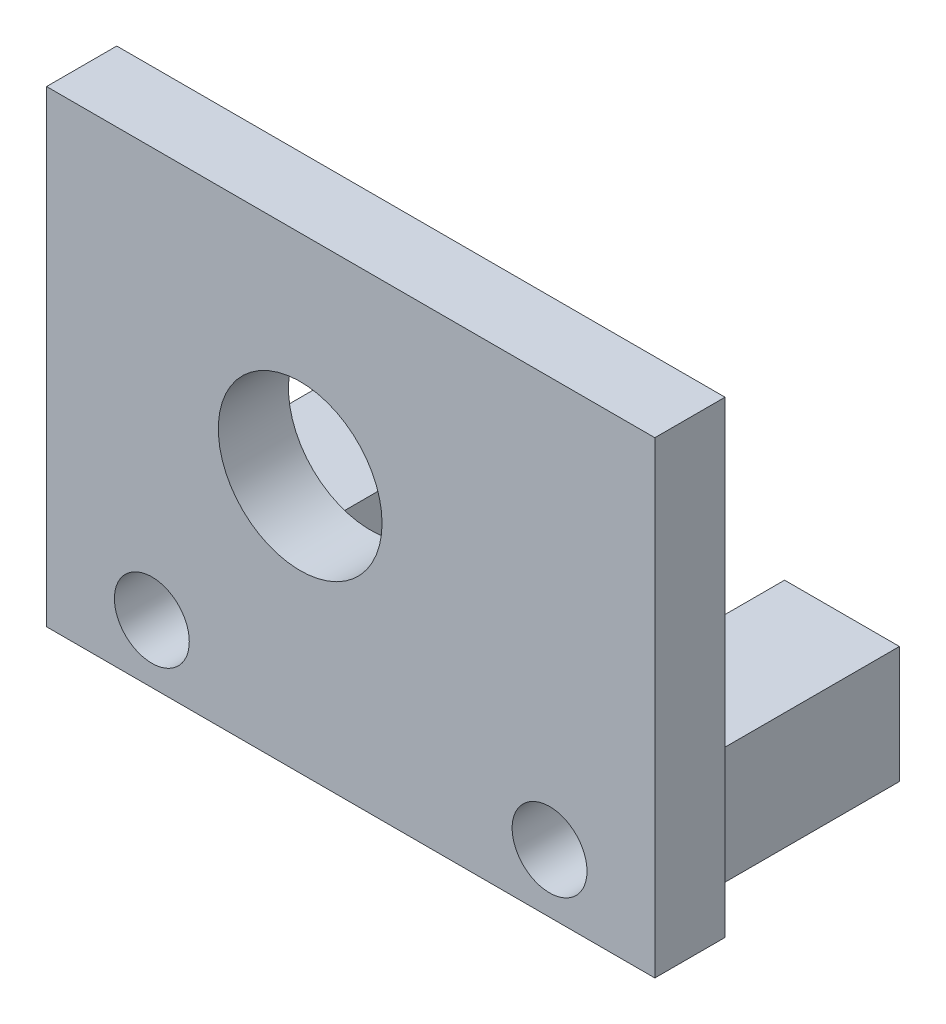
ISO-10303-21;
HEADER;
FILE_DESCRIPTION(('STEP AP214'),'2;1');
FILE_NAME('part.step','',(''),(''),'','','');
FILE_SCHEMA(('AUTOMOTIVE_DESIGN { 1 0 10303 214 1 1 1 1 }'));
ENDSEC;
DATA;
#1=APPLICATION_CONTEXT('core data for automotive mechanical design processes');
#2=APPLICATION_PROTOCOL_DEFINITION('international standard','automotive_design',2000,#1);
#3=PRODUCT_CONTEXT('',#1,'mechanical');
#4=PRODUCT('Part','Part','',(#3));
#5=PRODUCT_RELATED_PRODUCT_CATEGORY('part','',(#4));
#6=PRODUCT_DEFINITION_FORMATION('','',#4);
#7=PRODUCT_DEFINITION_CONTEXT('part definition',#1,'design');
#8=PRODUCT_DEFINITION('design','',#6,#7);
#9=PRODUCT_DEFINITION_SHAPE('','',#8);
#10=(LENGTH_UNIT() NAMED_UNIT(*) SI_UNIT(.MILLI.,.METRE.));
#11=(NAMED_UNIT(*) PLANE_ANGLE_UNIT() SI_UNIT($,.RADIAN.));
#12=(NAMED_UNIT(*) SI_UNIT($,.STERADIAN.) SOLID_ANGLE_UNIT());
#13=UNCERTAINTY_MEASURE_WITH_UNIT(LENGTH_MEASURE(1.E-05),#10,'distance_accuracy_value','');
#14=(GEOMETRIC_REPRESENTATION_CONTEXT(3) GLOBAL_UNCERTAINTY_ASSIGNED_CONTEXT((#13)) GLOBAL_UNIT_ASSIGNED_CONTEXT((#10,
#11,#12)) REPRESENTATION_CONTEXT('',''));
#15=CARTESIAN_POINT('',(0.,0.,0.));
#16=DIRECTION('',(0.,0.,1.));
#17=DIRECTION('',(1.,0.,0.));
#18=AXIS2_PLACEMENT_3D('',#15,#16,#17);
#19=CARTESIAN_POINT('',(0.,0.,3.));
#20=DIRECTION('',(0.,0.,1.));
#21=DIRECTION('',(1.,0.,0.));
#22=AXIS2_PLACEMENT_3D('',#19,#20,#21);
#23=PLANE('',#22);
#24=CARTESIAN_POINT('',(-6.34,-8.5,3.));
#25=DIRECTION('',(0.,0.,1.));
#26=DIRECTION('',(1.,0.,0.));
#27=AXIS2_PLACEMENT_3D('',#24,#25,#26);
#28=CIRCLE('',#27,1.6);
#29=CARTESIAN_POINT('',(-4.74,-8.5,3.));
#30=VERTEX_POINT('',#29);
#31=EDGE_CURVE('E223',#30,#30,#28,.T.);
#32=ORIENTED_EDGE('',*,*,#31,.F.);
#33=EDGE_LOOP('',(#32));
#34=FACE_BOUND('',#33,.T.);
#35=DIRECTION('',(0.,-1.,0.));
#36=VECTOR('',#35,1.);
#37=CARTESIAN_POINT('',(-10.84,9.,3.));
#38=LINE('',#37,#36);
#39=CARTESIAN_POINT('',(-10.84,9.,3.));
#40=VERTEX_POINT('',#39);
#41=CARTESIAN_POINT('',(-10.84,-11.,3.));
#42=VERTEX_POINT('',#41);
#43=EDGE_CURVE('E236',#40,#42,#38,.T.);
#44=ORIENTED_EDGE('',*,*,#43,.T.);
#45=DIRECTION('',(1.,0.,0.));
#46=VECTOR('',#45,1.);
#47=CARTESIAN_POINT('',(-10.84,-11.,3.));
#48=LINE('',#47,#46);
#49=CARTESIAN_POINT('',(15.16,-11.,3.));
#50=VERTEX_POINT('',#49);
#51=EDGE_CURVE('E240',#42,#50,#48,.T.);
#52=ORIENTED_EDGE('',*,*,#51,.T.);
#53=DIRECTION('',(0.,1.,0.));
#54=VECTOR('',#53,1.);
#55=CARTESIAN_POINT('',(15.16,9.,3.));
#56=LINE('',#55,#54);
#57=CARTESIAN_POINT('',(15.16,9.,3.));
#58=VERTEX_POINT('',#57);
#59=EDGE_CURVE('E244',#50,#58,#56,.T.);
#60=ORIENTED_EDGE('',*,*,#59,.T.);
#61=DIRECTION('',(-1.,0.,0.));
#62=VECTOR('',#61,1.);
#63=CARTESIAN_POINT('',(-10.84,9.,3.));
#64=LINE('',#63,#62);
#65=EDGE_CURVE('E247',#58,#40,#64,.T.);
#66=ORIENTED_EDGE('',*,*,#65,.T.);
#67=EDGE_LOOP('',(#44,#52,#60,#66));
#68=FACE_BOUND('',#67,.T.);
#69=CARTESIAN_POINT('',(0.,0.,3.));
#70=DIRECTION('',(0.,0.,1.));
#71=DIRECTION('',(1.,0.,0.));
#72=AXIS2_PLACEMENT_3D('',#69,#70,#71);
#73=CIRCLE('',#72,3.5);
#74=CARTESIAN_POINT('',(3.5,0.,3.));
#75=VERTEX_POINT('',#74);
#76=EDGE_CURVE('E228',#75,#75,#73,.T.);
#77=ORIENTED_EDGE('',*,*,#76,.F.);
#78=EDGE_LOOP('',(#77));
#79=FACE_BOUND('',#78,.T.);
#80=CARTESIAN_POINT('',(10.66,-8.5,3.));
#81=DIRECTION('',(0.,0.,1.));
#82=DIRECTION('',(1.,0.,0.));
#83=AXIS2_PLACEMENT_3D('',#80,#81,#82);
#84=CIRCLE('',#83,1.6);
#85=CARTESIAN_POINT('',(12.26,-8.5,3.));
#86=VERTEX_POINT('',#85);
#87=EDGE_CURVE('E212',#86,#86,#84,.T.);
#88=ORIENTED_EDGE('',*,*,#87,.F.);
#89=EDGE_LOOP('',(#88));
#90=FACE_BOUND('',#89,.T.);
#91=ADVANCED_FACE('F39',(#34,#68,#79,#90),#23,.T.);
#92=CARTESIAN_POINT('',(0.,0.,0.));
#93=DIRECTION('',(0.,0.,1.));
#94=DIRECTION('',(1.,0.,0.));
#95=AXIS2_PLACEMENT_3D('',#92,#93,#94);
#96=PLANE('',#95);
#97=DIRECTION('',(1.,0.,0.));
#98=VECTOR('',#97,1.);
#99=CARTESIAN_POINT('',(-10.84,-11.,0.));
#100=LINE('',#99,#98);
#101=CARTESIAN_POINT('',(13.1145705546597,-11.,0.));
#102=VERTEX_POINT('',#101);
#103=CARTESIAN_POINT('',(15.16,-11.,0.));
#104=VERTEX_POINT('',#103);
#105=EDGE_CURVE('E254',#102,#104,#100,.T.);
#106=ORIENTED_EDGE('',*,*,#105,.F.);
#107=DIRECTION('',(0.,1.,0.));
#108=VECTOR('',#107,1.);
#109=CARTESIAN_POINT('',(13.1145705546597,-6.,0.));
#110=LINE('',#109,#108);
#111=CARTESIAN_POINT('',(13.1145705546597,-6.,0.));
#112=VERTEX_POINT('',#111);
#113=EDGE_CURVE('E55',#102,#112,#110,.T.);
#114=ORIENTED_EDGE('',*,*,#113,.T.);
#115=DIRECTION('',(-1.,0.,0.));
#116=VECTOR('',#115,1.);
#117=CARTESIAN_POINT('',(8.20542944534033,-6.,0.));
#118=LINE('',#117,#116);
#119=CARTESIAN_POINT('',(8.20542944534033,-6.,0.));
#120=VERTEX_POINT('',#119);
#121=EDGE_CURVE('E135',#112,#120,#118,.T.);
#122=ORIENTED_EDGE('',*,*,#121,.T.);
#123=DIRECTION('',(0.,-1.,0.));
#124=VECTOR('',#123,1.);
#125=CARTESIAN_POINT('',(8.20542944534033,-6.,0.));
#126=LINE('',#125,#124);
#127=CARTESIAN_POINT('',(8.20542944534033,-11.,0.));
#128=VERTEX_POINT('',#127);
#129=EDGE_CURVE('E155',#120,#128,#126,.T.);
#130=ORIENTED_EDGE('',*,*,#129,.T.);
#131=CARTESIAN_POINT('',(-3.7752522737621,-11.,0.));
#132=VERTEX_POINT('',#131);
#133=EDGE_CURVE('E260',#132,#128,#100,.T.);
#134=ORIENTED_EDGE('',*,*,#133,.F.);
#135=DIRECTION('',(0.,1.,0.));
#136=VECTOR('',#135,1.);
#137=CARTESIAN_POINT('',(-3.7752522737621,-6.,0.));
#138=LINE('',#137,#136);
#139=CARTESIAN_POINT('',(-3.7752522737621,-6.,0.));
#140=VERTEX_POINT('',#139);
#141=EDGE_CURVE('E182',#132,#140,#138,.T.);
#142=ORIENTED_EDGE('',*,*,#141,.T.);
#143=DIRECTION('',(-1.,0.,0.));
#144=VECTOR('',#143,1.);
#145=CARTESIAN_POINT('',(-8.90474772623789,-6.,0.));
#146=LINE('',#145,#144);
#147=CARTESIAN_POINT('',(-8.90474772623789,-6.,0.));
#148=VERTEX_POINT('',#147);
#149=EDGE_CURVE('E203',#140,#148,#146,.T.);
#150=ORIENTED_EDGE('',*,*,#149,.T.);
#151=DIRECTION('',(0.,-1.,0.));
#152=VECTOR('',#151,1.);
#153=CARTESIAN_POINT('',(-8.90474772623789,-6.,0.));
#154=LINE('',#153,#152);
#155=CARTESIAN_POINT('',(-8.90474772623789,-11.,0.));
#156=VERTEX_POINT('',#155);
#157=EDGE_CURVE('E188',#148,#156,#154,.T.);
#158=ORIENTED_EDGE('',*,*,#157,.T.);
#159=CARTESIAN_POINT('',(-10.84,-11.,0.));
#160=VERTEX_POINT('',#159);
#161=EDGE_CURVE('E255',#160,#156,#100,.T.);
#162=ORIENTED_EDGE('',*,*,#161,.F.);
#163=DIRECTION('',(0.,-1.,0.));
#164=VECTOR('',#163,1.);
#165=CARTESIAN_POINT('',(-10.84,9.,0.));
#166=LINE('',#165,#164);
#167=CARTESIAN_POINT('',(-10.84,9.,0.));
#168=VERTEX_POINT('',#167);
#169=EDGE_CURVE('E232',#168,#160,#166,.T.);
#170=ORIENTED_EDGE('',*,*,#169,.F.);
#171=DIRECTION('',(-1.,0.,0.));
#172=VECTOR('',#171,1.);
#173=CARTESIAN_POINT('',(-10.84,9.,0.));
#174=LINE('',#173,#172);
#175=CARTESIAN_POINT('',(15.16,9.,0.));
#176=VERTEX_POINT('',#175);
#177=EDGE_CURVE('E241',#176,#168,#174,.T.);
#178=ORIENTED_EDGE('',*,*,#177,.F.);
#179=DIRECTION('',(0.,1.,0.));
#180=VECTOR('',#179,1.);
#181=CARTESIAN_POINT('',(15.16,9.,0.));
#182=LINE('',#181,#180);
#183=EDGE_CURVE('E259',#104,#176,#182,.T.);
#184=ORIENTED_EDGE('',*,*,#183,.F.);
#185=EDGE_LOOP('',(#106,#114,#122,#130,#134,#142,#150,#158,#162,#170,#178,#184));
#186=FACE_BOUND('',#185,.T.);
#187=CARTESIAN_POINT('',(0.,0.,0.));
#188=DIRECTION('',(0.,0.,1.));
#189=DIRECTION('',(1.,0.,0.));
#190=AXIS2_PLACEMENT_3D('',#187,#188,#189);
#191=CIRCLE('',#190,3.5);
#192=CARTESIAN_POINT('',(3.5,0.,0.));
#193=VERTEX_POINT('',#192);
#194=EDGE_CURVE('E227',#193,#193,#191,.T.);
#195=ORIENTED_EDGE('',*,*,#194,.T.);
#196=EDGE_LOOP('',(#195));
#197=FACE_BOUND('',#196,.T.);
#198=ADVANCED_FACE('F283',(#186,#197),#96,.F.);
#199=CARTESIAN_POINT('',(-10.84,9.,3.));
#200=DIRECTION('',(1.,0.,0.));
#201=DIRECTION('',(0.,0.,-1.));
#202=AXIS2_PLACEMENT_3D('',#199,#200,#201);
#203=PLANE('',#202);
#204=ORIENTED_EDGE('',*,*,#169,.T.);
#205=DIRECTION('',(0.,0.,-1.));
#206=VECTOR('',#205,1.);
#207=CARTESIAN_POINT('',(-10.84,-11.,3.));
#208=LINE('',#207,#206);
#209=EDGE_CURVE('E11',#42,#160,#208,.T.);
#210=ORIENTED_EDGE('',*,*,#209,.F.);
#211=ORIENTED_EDGE('',*,*,#43,.F.);
#212=DIRECTION('',(0.,0.,-1.));
#213=VECTOR('',#212,1.);
#214=CARTESIAN_POINT('',(-10.84,9.,3.));
#215=LINE('',#214,#213);
#216=EDGE_CURVE('E250',#40,#168,#215,.T.);
#217=ORIENTED_EDGE('',*,*,#216,.T.);
#218=EDGE_LOOP('',(#204,#210,#211,#217));
#219=FACE_BOUND('',#218,.T.);
#220=ADVANCED_FACE('F41',(#219),#203,.F.);
#221=CARTESIAN_POINT('',(-10.84,-11.,3.));
#222=DIRECTION('',(0.,1.,0.));
#223=DIRECTION('',(0.,0.,1.));
#224=AXIS2_PLACEMENT_3D('',#221,#222,#223);
#225=PLANE('',#224);
#226=ORIENTED_EDGE('',*,*,#161,.T.);
#227=DIRECTION('',(0.,0.,1.));
#228=VECTOR('',#227,1.);
#229=CARTESIAN_POINT('',(-8.90474772623789,-11.,-9.5));
#230=LINE('',#229,#228);
#231=CARTESIAN_POINT('',(-8.90474772623789,-11.,-9.5));
#232=VERTEX_POINT('',#231);
#233=EDGE_CURVE('E63',#232,#156,#230,.T.);
#234=ORIENTED_EDGE('',*,*,#233,.F.);
#235=DIRECTION('',(1.,0.,0.));
#236=VECTOR('',#235,1.);
#237=CARTESIAN_POINT('',(-8.90474772623789,-11.,-9.5));
#238=LINE('',#237,#236);
#239=CARTESIAN_POINT('',(-3.7752522737621,-11.,-9.5));
#240=VERTEX_POINT('',#239);
#241=EDGE_CURVE('E195',#232,#240,#238,.T.);
#242=ORIENTED_EDGE('',*,*,#241,.T.);
#243=DIRECTION('',(0.,0.,1.));
#244=VECTOR('',#243,1.);
#245=CARTESIAN_POINT('',(-3.7752522737621,-11.,-9.5));
#246=LINE('',#245,#244);
#247=EDGE_CURVE('E209',#240,#132,#246,.T.);
#248=ORIENTED_EDGE('',*,*,#247,.T.);
#249=ORIENTED_EDGE('',*,*,#133,.T.);
#250=DIRECTION('',(0.,0.,1.));
#251=VECTOR('',#250,1.);
#252=CARTESIAN_POINT('',(8.20542944534033,-11.,-9.5));
#253=LINE('',#252,#251);
#254=CARTESIAN_POINT('',(8.20542944534033,-11.,-9.5));
#255=VERTEX_POINT('',#254);
#256=EDGE_CURVE('E174',#255,#128,#253,.T.);
#257=ORIENTED_EDGE('',*,*,#256,.F.);
#258=DIRECTION('',(1.,0.,0.));
#259=VECTOR('',#258,1.);
#260=CARTESIAN_POINT('',(8.20542944534033,-11.,-9.5));
#261=LINE('',#260,#259);
#262=CARTESIAN_POINT('',(13.1145705546597,-11.,-9.5));
#263=VERTEX_POINT('',#262);
#264=EDGE_CURVE('E139',#255,#263,#261,.T.);
#265=ORIENTED_EDGE('',*,*,#264,.T.);
#266=DIRECTION('',(0.,0.,1.));
#267=VECTOR('',#266,1.);
#268=CARTESIAN_POINT('',(13.1145705546597,-11.,-9.5));
#269=LINE('',#268,#267);
#270=EDGE_CURVE('E153',#263,#102,#269,.T.);
#271=ORIENTED_EDGE('',*,*,#270,.T.);
#272=ORIENTED_EDGE('',*,*,#105,.T.);
#273=DIRECTION('',(0.,0.,-1.));
#274=VECTOR('',#273,1.);
#275=CARTESIAN_POINT('',(15.16,-11.,3.));
#276=LINE('',#275,#274);
#277=EDGE_CURVE('E48',#50,#104,#276,.T.);
#278=ORIENTED_EDGE('',*,*,#277,.F.);
#279=ORIENTED_EDGE('',*,*,#51,.F.);
#280=ORIENTED_EDGE('',*,*,#209,.T.);
#281=EDGE_LOOP('',(#226,#234,#242,#248,#249,#257,#265,#271,#272,#278,#279,#280));
#282=FACE_BOUND('',#281,.T.);
#283=ADVANCED_FACE('F295',(#282),#225,.F.);
#284=CARTESIAN_POINT('',(15.16,9.,3.));
#285=DIRECTION('',(-1.,0.,0.));
#286=DIRECTION('',(0.,0.,1.));
#287=AXIS2_PLACEMENT_3D('',#284,#285,#286);
#288=PLANE('',#287);
#289=ORIENTED_EDGE('',*,*,#183,.T.);
#290=DIRECTION('',(0.,0.,-1.));
#291=VECTOR('',#290,1.);
#292=CARTESIAN_POINT('',(15.16,9.,3.));
#293=LINE('',#292,#291);
#294=EDGE_CURVE('E268',#58,#176,#293,.T.);
#295=ORIENTED_EDGE('',*,*,#294,.F.);
#296=ORIENTED_EDGE('',*,*,#59,.F.);
#297=ORIENTED_EDGE('',*,*,#277,.T.);
#298=EDGE_LOOP('',(#289,#295,#296,#297));
#299=FACE_BOUND('',#298,.T.);
#300=ADVANCED_FACE('F277',(#299),#288,.F.);
#301=CARTESIAN_POINT('',(-10.84,9.,3.));
#302=DIRECTION('',(0.,-1.,0.));
#303=DIRECTION('',(0.,0.,-1.));
#304=AXIS2_PLACEMENT_3D('',#301,#302,#303);
#305=PLANE('',#304);
#306=ORIENTED_EDGE('',*,*,#177,.T.);
#307=ORIENTED_EDGE('',*,*,#216,.F.);
#308=ORIENTED_EDGE('',*,*,#65,.F.);
#309=ORIENTED_EDGE('',*,*,#294,.T.);
#310=EDGE_LOOP('',(#306,#307,#308,#309));
#311=FACE_BOUND('',#310,.T.);
#312=ADVANCED_FACE('F288',(#311),#305,.F.);
#313=CARTESIAN_POINT('',(0.,0.,3.));
#314=DIRECTION('',(0.,0.,-1.));
#315=DIRECTION('',(-1.,0.,0.));
#316=AXIS2_PLACEMENT_3D('',#313,#314,#315);
#317=CYLINDRICAL_SURFACE('',#316,3.5);
#318=ORIENTED_EDGE('',*,*,#76,.T.);
#319=EDGE_LOOP('',(#318));
#320=FACE_BOUND('',#319,.T.);
#321=ORIENTED_EDGE('',*,*,#194,.F.);
#322=EDGE_LOOP('',(#321));
#323=FACE_BOUND('',#322,.T.);
#324=ADVANCED_FACE('F334',(#320,#323),#317,.F.);
#325=CARTESIAN_POINT('',(-6.34,-8.5,3.));
#326=DIRECTION('',(0.,0.,-1.));
#327=DIRECTION('',(-1.,0.,0.));
#328=AXIS2_PLACEMENT_3D('',#325,#326,#327);
#329=CYLINDRICAL_SURFACE('',#328,1.6);
#330=ORIENTED_EDGE('',*,*,#31,.T.);
#331=EDGE_LOOP('',(#330));
#332=FACE_BOUND('',#331,.T.);
#333=CARTESIAN_POINT('',(-6.34,-8.5,-9.5));
#334=DIRECTION('',(0.,0.,1.));
#335=DIRECTION('',(1.,0.,0.));
#336=AXIS2_PLACEMENT_3D('',#333,#334,#335);
#337=CIRCLE('',#336,1.6);
#338=CARTESIAN_POINT('',(-4.74,-8.5,-9.5));
#339=VERTEX_POINT('',#338);
#340=EDGE_CURVE('E173',#339,#339,#337,.T.);
#341=ORIENTED_EDGE('',*,*,#340,.F.);
#342=EDGE_LOOP('',(#341));
#343=FACE_BOUND('',#342,.T.);
#344=ADVANCED_FACE('F368',(#332,#343),#329,.F.);
#345=CARTESIAN_POINT('',(10.66,-8.5,3.));
#346=DIRECTION('',(0.,0.,-1.));
#347=DIRECTION('',(-1.,0.,0.));
#348=AXIS2_PLACEMENT_3D('',#345,#346,#347);
#349=CYLINDRICAL_SURFACE('',#348,1.6);
#350=ORIENTED_EDGE('',*,*,#87,.T.);
#351=EDGE_LOOP('',(#350));
#352=FACE_BOUND('',#351,.T.);
#353=CARTESIAN_POINT('',(10.66,-8.5,-9.5));
#354=DIRECTION('',(0.,0.,1.));
#355=DIRECTION('',(1.,0.,0.));
#356=AXIS2_PLACEMENT_3D('',#353,#354,#355);
#357=CIRCLE('',#356,1.6);
#358=CARTESIAN_POINT('',(12.26,-8.5,-9.5));
#359=VERTEX_POINT('',#358);
#360=EDGE_CURVE('E161',#359,#359,#357,.T.);
#361=ORIENTED_EDGE('',*,*,#360,.F.);
#362=EDGE_LOOP('',(#361));
#363=FACE_BOUND('',#362,.T.);
#364=ADVANCED_FACE('F372',(#352,#363),#349,.F.);
#365=CARTESIAN_POINT('',(-3.7752522737621,-6.,-9.5));
#366=DIRECTION('',(1.,0.,0.));
#367=DIRECTION('',(0.,0.,-1.));
#368=AXIS2_PLACEMENT_3D('',#365,#366,#367);
#369=PLANE('',#368);
#370=ORIENTED_EDGE('',*,*,#141,.F.);
#371=ORIENTED_EDGE('',*,*,#247,.F.);
#372=DIRECTION('',(0.,1.,0.));
#373=VECTOR('',#372,1.);
#374=CARTESIAN_POINT('',(-3.7752522737621,-6.,-9.5));
#375=LINE('',#374,#373);
#376=CARTESIAN_POINT('',(-3.7752522737621,-6.,-9.5));
#377=VERTEX_POINT('',#376);
#378=EDGE_CURVE('E183',#240,#377,#375,.T.);
#379=ORIENTED_EDGE('',*,*,#378,.T.);
#380=DIRECTION('',(0.,0.,1.));
#381=VECTOR('',#380,1.);
#382=CARTESIAN_POINT('',(-3.7752522737621,-6.,-9.5));
#383=LINE('',#382,#381);
#384=EDGE_CURVE('E199',#377,#140,#383,.T.);
#385=ORIENTED_EDGE('',*,*,#384,.T.);
#386=EDGE_LOOP('',(#370,#371,#379,#385));
#387=FACE_BOUND('',#386,.T.);
#388=ADVANCED_FACE('F308',(#387),#369,.T.);
#389=CARTESIAN_POINT('',(-8.90474772623789,-6.,-9.5));
#390=DIRECTION('',(-1.,0.,0.));
#391=DIRECTION('',(0.,0.,1.));
#392=AXIS2_PLACEMENT_3D('',#389,#390,#391);
#393=PLANE('',#392);
#394=ORIENTED_EDGE('',*,*,#157,.F.);
#395=DIRECTION('',(0.,0.,1.));
#396=VECTOR('',#395,1.);
#397=CARTESIAN_POINT('',(-8.90474772623789,-6.,-9.5));
#398=LINE('',#397,#396);
#399=CARTESIAN_POINT('',(-8.90474772623789,-6.,-9.5));
#400=VERTEX_POINT('',#399);
#401=EDGE_CURVE('E215',#400,#148,#398,.T.);
#402=ORIENTED_EDGE('',*,*,#401,.F.);
#403=DIRECTION('',(0.,-1.,0.));
#404=VECTOR('',#403,1.);
#405=CARTESIAN_POINT('',(-8.90474772623789,-6.,-9.5));
#406=LINE('',#405,#404);
#407=EDGE_CURVE('E192',#400,#232,#406,.T.);
#408=ORIENTED_EDGE('',*,*,#407,.T.);
#409=ORIENTED_EDGE('',*,*,#233,.T.);
#410=EDGE_LOOP('',(#394,#402,#408,#409));
#411=FACE_BOUND('',#410,.T.);
#412=ADVANCED_FACE('F297',(#411),#393,.T.);
#413=CARTESIAN_POINT('',(-8.90474772623789,-6.,-9.5));
#414=DIRECTION('',(0.,1.,0.));
#415=DIRECTION('',(0.,0.,1.));
#416=AXIS2_PLACEMENT_3D('',#413,#414,#415);
#417=PLANE('',#416);
#418=ORIENTED_EDGE('',*,*,#149,.F.);
#419=ORIENTED_EDGE('',*,*,#384,.F.);
#420=DIRECTION('',(-1.,0.,0.));
#421=VECTOR('',#420,1.);
#422=CARTESIAN_POINT('',(-8.90474772623789,-6.,-9.5));
#423=LINE('',#422,#421);
#424=EDGE_CURVE('E187',#377,#400,#423,.T.);
#425=ORIENTED_EDGE('',*,*,#424,.T.);
#426=ORIENTED_EDGE('',*,*,#401,.T.);
#427=EDGE_LOOP('',(#418,#419,#425,#426));
#428=FACE_BOUND('',#427,.T.);
#429=ADVANCED_FACE('F305',(#428),#417,.T.);
#430=CARTESIAN_POINT('',(0.,0.,-9.5));
#431=DIRECTION('',(0.,0.,1.));
#432=DIRECTION('',(1.,0.,0.));
#433=AXIS2_PLACEMENT_3D('',#430,#431,#432);
#434=PLANE('',#433);
#435=ORIENTED_EDGE('',*,*,#340,.T.);
#436=EDGE_LOOP('',(#435));
#437=FACE_BOUND('',#436,.T.);
#438=ORIENTED_EDGE('',*,*,#378,.F.);
#439=ORIENTED_EDGE('',*,*,#241,.F.);
#440=ORIENTED_EDGE('',*,*,#407,.F.);
#441=ORIENTED_EDGE('',*,*,#424,.F.);
#442=EDGE_LOOP('',(#438,#439,#440,#441));
#443=FACE_BOUND('',#442,.T.);
#444=ADVANCED_FACE('F304',(#437,#443),#434,.F.);
#445=CARTESIAN_POINT('',(13.1145705546597,-6.,-9.5));
#446=DIRECTION('',(1.,0.,0.));
#447=DIRECTION('',(0.,0.,-1.));
#448=AXIS2_PLACEMENT_3D('',#445,#446,#447);
#449=PLANE('',#448);
#450=ORIENTED_EDGE('',*,*,#113,.F.);
#451=ORIENTED_EDGE('',*,*,#270,.F.);
#452=DIRECTION('',(0.,1.,0.));
#453=VECTOR('',#452,1.);
#454=CARTESIAN_POINT('',(13.1145705546597,-6.,-9.5));
#455=LINE('',#454,#453);
#456=CARTESIAN_POINT('',(13.1145705546597,-6.,-9.5));
#457=VERTEX_POINT('',#456);
#458=EDGE_CURVE('E146',#263,#457,#455,.T.);
#459=ORIENTED_EDGE('',*,*,#458,.T.);
#460=DIRECTION('',(0.,0.,1.));
#461=VECTOR('',#460,1.);
#462=CARTESIAN_POINT('',(13.1145705546597,-6.,-9.5));
#463=LINE('',#462,#461);
#464=EDGE_CURVE('E130',#457,#112,#463,.T.);
#465=ORIENTED_EDGE('',*,*,#464,.T.);
#466=EDGE_LOOP('',(#450,#451,#459,#465));
#467=FACE_BOUND('',#466,.T.);
#468=ADVANCED_FACE('F152',(#467),#449,.T.);
#469=CARTESIAN_POINT('',(8.20542944534033,-6.,-9.5));
#470=DIRECTION('',(-1.,0.,0.));
#471=DIRECTION('',(0.,0.,1.));
#472=AXIS2_PLACEMENT_3D('',#469,#470,#471);
#473=PLANE('',#472);
#474=ORIENTED_EDGE('',*,*,#129,.F.);
#475=DIRECTION('',(0.,0.,1.));
#476=VECTOR('',#475,1.);
#477=CARTESIAN_POINT('',(8.20542944534033,-6.,-9.5));
#478=LINE('',#477,#476);
#479=CARTESIAN_POINT('',(8.20542944534033,-6.,-9.5));
#480=VERTEX_POINT('',#479);
#481=EDGE_CURVE('E138',#480,#120,#478,.T.);
#482=ORIENTED_EDGE('',*,*,#481,.F.);
#483=DIRECTION('',(0.,-1.,0.));
#484=VECTOR('',#483,1.);
#485=CARTESIAN_POINT('',(8.20542944534033,-6.,-9.5));
#486=LINE('',#485,#484);
#487=EDGE_CURVE('E149',#480,#255,#486,.T.);
#488=ORIENTED_EDGE('',*,*,#487,.T.);
#489=ORIENTED_EDGE('',*,*,#256,.T.);
#490=EDGE_LOOP('',(#474,#482,#488,#489));
#491=FACE_BOUND('',#490,.T.);
#492=ADVANCED_FACE('F315',(#491),#473,.T.);
#493=CARTESIAN_POINT('',(8.20542944534033,-6.,-9.5));
#494=DIRECTION('',(0.,1.,0.));
#495=DIRECTION('',(0.,0.,1.));
#496=AXIS2_PLACEMENT_3D('',#493,#494,#495);
#497=PLANE('',#496);
#498=ORIENTED_EDGE('',*,*,#121,.F.);
#499=ORIENTED_EDGE('',*,*,#464,.F.);
#500=DIRECTION('',(-1.,0.,0.));
#501=VECTOR('',#500,1.);
#502=CARTESIAN_POINT('',(8.20542944534033,-6.,-9.5));
#503=LINE('',#502,#501);
#504=EDGE_CURVE('E133',#457,#480,#503,.T.);
#505=ORIENTED_EDGE('',*,*,#504,.T.);
#506=ORIENTED_EDGE('',*,*,#481,.T.);
#507=EDGE_LOOP('',(#498,#499,#505,#506));
#508=FACE_BOUND('',#507,.T.);
#509=ADVANCED_FACE('F132',(#508),#497,.T.);
#510=CARTESIAN_POINT('',(0.,0.,-9.5));
#511=DIRECTION('',(0.,0.,1.));
#512=DIRECTION('',(1.,0.,0.));
#513=AXIS2_PLACEMENT_3D('',#510,#511,#512);
#514=PLANE('',#513);
#515=ORIENTED_EDGE('',*,*,#360,.T.);
#516=EDGE_LOOP('',(#515));
#517=FACE_BOUND('',#516,.T.);
#518=ORIENTED_EDGE('',*,*,#458,.F.);
#519=ORIENTED_EDGE('',*,*,#264,.F.);
#520=ORIENTED_EDGE('',*,*,#487,.F.);
#521=ORIENTED_EDGE('',*,*,#504,.F.);
#522=EDGE_LOOP('',(#518,#519,#520,#521));
#523=FACE_BOUND('',#522,.T.);
#524=ADVANCED_FACE('F144',(#517,#523),#514,.F.);
#525=CLOSED_SHELL('',(#91,#198,#220,#283,#300,#312,#324,#344,#364,#388,#412,#429,#444,#468,#492,
#509,#524));
#526=MANIFOLD_SOLID_BREP('B2',#525);
#527=ADVANCED_BREP_SHAPE_REPRESENTATION('',(#18,#526),#14);
#528=SHAPE_DEFINITION_REPRESENTATION(#9,#527);
ENDSEC;
END-ISO-10303-21;
